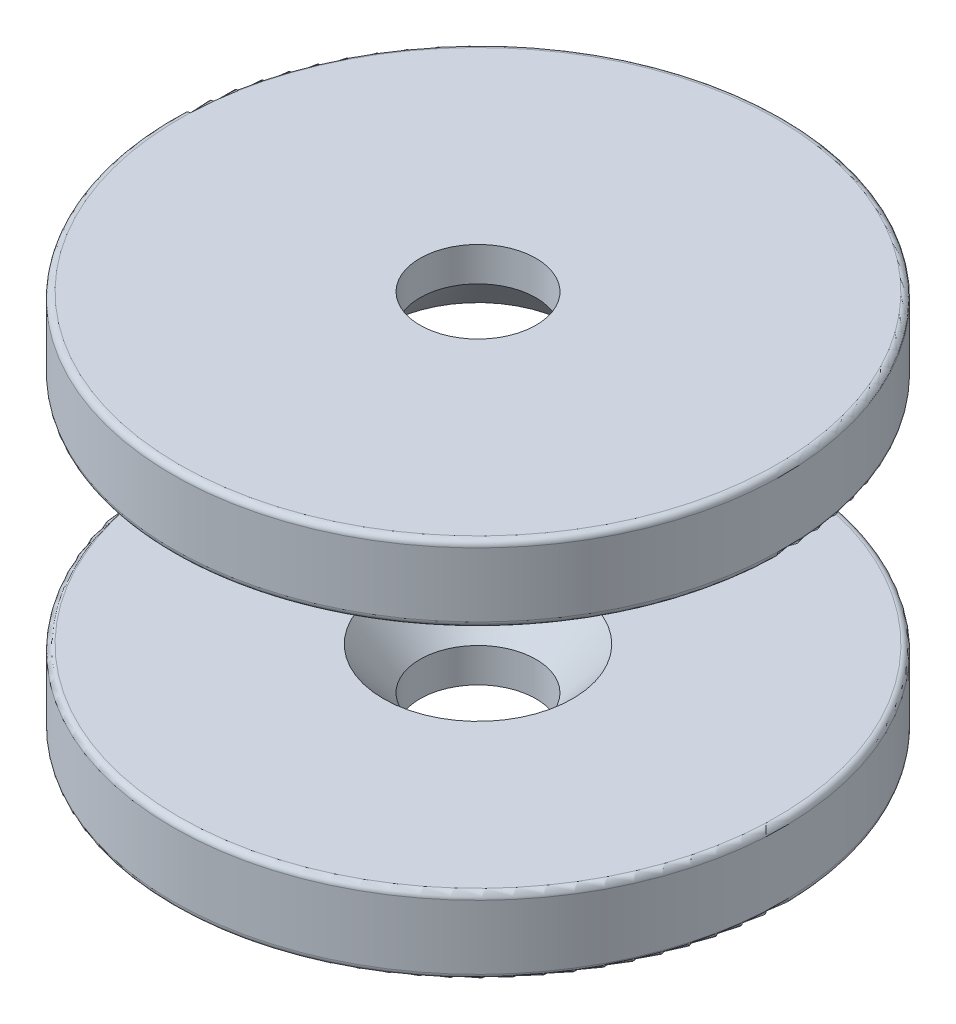
ISO-10303-21;
HEADER;
FILE_DESCRIPTION(('STEP AP214'),'2;1');
FILE_NAME('part.step','',(''),(''),'','','');
FILE_SCHEMA(('AUTOMOTIVE_DESIGN { 1 0 10303 214 1 1 1 1 }'));
ENDSEC;
DATA;
#1=APPLICATION_CONTEXT('core data for automotive mechanical design processes');
#2=APPLICATION_PROTOCOL_DEFINITION('international standard','automotive_design',2000,#1);
#3=PRODUCT_CONTEXT('',#1,'mechanical');
#4=PRODUCT('Part','Part','',(#3));
#5=PRODUCT_RELATED_PRODUCT_CATEGORY('part','',(#4));
#6=PRODUCT_DEFINITION_FORMATION('','',#4);
#7=PRODUCT_DEFINITION_CONTEXT('part definition',#1,'design');
#8=PRODUCT_DEFINITION('design','',#6,#7);
#9=PRODUCT_DEFINITION_SHAPE('','',#8);
#10=(LENGTH_UNIT() NAMED_UNIT(*) SI_UNIT(.MILLI.,.METRE.));
#11=(NAMED_UNIT(*) PLANE_ANGLE_UNIT() SI_UNIT($,.RADIAN.));
#12=(NAMED_UNIT(*) SI_UNIT($,.STERADIAN.) SOLID_ANGLE_UNIT());
#13=UNCERTAINTY_MEASURE_WITH_UNIT(LENGTH_MEASURE(1.E-05),#10,'distance_accuracy_value','');
#14=(GEOMETRIC_REPRESENTATION_CONTEXT(3) GLOBAL_UNCERTAINTY_ASSIGNED_CONTEXT((#13)) GLOBAL_UNIT_ASSIGNED_CONTEXT((#10,
#11,#12)) REPRESENTATION_CONTEXT('',''));
#15=CARTESIAN_POINT('',(0.,0.,0.));
#16=DIRECTION('',(0.,0.,1.));
#17=DIRECTION('',(1.,0.,0.));
#18=AXIS2_PLACEMENT_3D('',#15,#16,#17);
#19=CARTESIAN_POINT('',(0.,11.1125,0.));
#20=DIRECTION('',(0.,-1.,0.));
#21=DIRECTION('',(0.,0.,-1.));
#22=AXIS2_PLACEMENT_3D('',#19,#20,#21);
#23=PLANE('',#22);
#24=CARTESIAN_POINT('',(0.,11.1125,0.));
#25=DIRECTION('',(0.,-1.,0.));
#26=DIRECTION('',(0.,0.,-1.));
#27=AXIS2_PLACEMENT_3D('',#24,#25,#26);
#28=CIRCLE('',#27,3.937);
#29=CARTESIAN_POINT('',(0.,11.1125,-3.93700000000001));
#30=VERTEX_POINT('',#29);
#31=EDGE_CURVE('E61',#30,#30,#28,.T.);
#32=ORIENTED_EDGE('',*,*,#31,.F.);
#33=EDGE_LOOP('',(#32));
#34=FACE_BOUND('',#33,.T.);
#35=CARTESIAN_POINT('',(0.,11.1125,0.));
#36=DIRECTION('',(0.,-1.,0.));
#37=DIRECTION('',(0.,0.,-1.));
#38=AXIS2_PLACEMENT_3D('',#35,#36,#37);
#39=CIRCLE('',#38,12.446);
#40=CARTESIAN_POINT('',(0.,11.1125000000001,-12.446));
#41=VERTEX_POINT('',#40);
#42=EDGE_CURVE('E11',#41,#41,#39,.T.);
#43=ORIENTED_EDGE('',*,*,#42,.T.);
#44=EDGE_LOOP('',(#43));
#45=FACE_BOUND('',#44,.T.);
#46=ADVANCED_FACE('F38',(#34,#45),#23,.T.);
#47=CARTESIAN_POINT('',(0.,14.2875,0.));
#48=DIRECTION('',(0.,-1.,0.));
#49=DIRECTION('',(0.,0.,-1.));
#50=AXIS2_PLACEMENT_3D('',#47,#48,#49);
#51=PLANE('',#50);
#52=CARTESIAN_POINT('',(0.,14.2875,0.));
#53=DIRECTION('',(0.,-1.,0.));
#54=DIRECTION('',(0.,0.,-1.));
#55=AXIS2_PLACEMENT_3D('',#52,#53,#54);
#56=CIRCLE('',#55,12.446);
#57=CARTESIAN_POINT('',(0.,14.2875000000001,-12.446));
#58=VERTEX_POINT('',#57);
#59=EDGE_CURVE('E46',#58,#58,#56,.F.);
#60=ORIENTED_EDGE('',*,*,#59,.T.);
#61=EDGE_LOOP('',(#60));
#62=FACE_BOUND('',#61,.T.);
#63=CARTESIAN_POINT('',(0.,14.2875,0.));
#64=DIRECTION('',(0.,-1.,0.));
#65=DIRECTION('',(0.,0.,-1.));
#66=AXIS2_PLACEMENT_3D('',#63,#64,#65);
#67=CIRCLE('',#66,2.413);
#68=CARTESIAN_POINT('',(0.,14.2875,-2.41299999999999));
#69=VERTEX_POINT('',#68);
#70=EDGE_CURVE('E58',#69,#69,#67,.T.);
#71=ORIENTED_EDGE('',*,*,#70,.T.);
#72=EDGE_LOOP('',(#71));
#73=FACE_BOUND('',#72,.T.);
#74=ADVANCED_FACE('F78',(#62,#73),#51,.F.);
#75=CARTESIAN_POINT('',(0.,11.1125,0.));
#76=DIRECTION('',(0.,1.,0.));
#77=DIRECTION('',(0.,0.,1.));
#78=AXIS2_PLACEMENT_3D('',#75,#76,#77);
#79=CYLINDRICAL_SURFACE('',#78,12.7);
#80=CARTESIAN_POINT('',(0.,14.0335,0.));
#81=DIRECTION('',(0.,-1.,0.));
#82=DIRECTION('',(0.,0.,-1.));
#83=AXIS2_PLACEMENT_3D('',#80,#81,#82);
#84=CIRCLE('',#83,12.7);
#85=CARTESIAN_POINT('',(0.,14.0335000000001,-12.7));
#86=VERTEX_POINT('',#85);
#87=EDGE_CURVE('E50',#86,#86,#84,.T.);
#88=ORIENTED_EDGE('',*,*,#87,.T.);
#89=EDGE_LOOP('',(#88));
#90=FACE_BOUND('',#89,.T.);
#91=CARTESIAN_POINT('',(0.,11.3665,0.));
#92=DIRECTION('',(0.,-1.,0.));
#93=DIRECTION('',(0.,0.,-1.));
#94=AXIS2_PLACEMENT_3D('',#91,#92,#93);
#95=CIRCLE('',#94,12.7);
#96=CARTESIAN_POINT('',(0.,11.3665000000001,-12.7));
#97=VERTEX_POINT('',#96);
#98=EDGE_CURVE('E55',#97,#97,#95,.F.);
#99=ORIENTED_EDGE('',*,*,#98,.T.);
#100=EDGE_LOOP('',(#99));
#101=FACE_BOUND('',#100,.T.);
#102=ADVANCED_FACE('F74',(#90,#101),#79,.T.);
#103=CARTESIAN_POINT('',(0.,11.1125,0.));
#104=DIRECTION('',(0.,1.,0.));
#105=DIRECTION('',(0.,0.,1.));
#106=AXIS2_PLACEMENT_3D('',#103,#104,#105);
#107=CYLINDRICAL_SURFACE('',#106,2.413);
#108=CARTESIAN_POINT('',(0.,12.8656614526048,0.));
#109=DIRECTION('',(0.,-1.,0.));
#110=DIRECTION('',(0.,0.,-1.));
#111=AXIS2_PLACEMENT_3D('',#108,#109,#110);
#112=CIRCLE('',#111,2.413);
#113=CARTESIAN_POINT('',(0.,12.8656614526048,-2.413));
#114=VERTEX_POINT('',#113);
#115=EDGE_CURVE('E42',#114,#114,#112,.F.);
#116=ORIENTED_EDGE('',*,*,#115,.F.);
#117=EDGE_LOOP('',(#116));
#118=FACE_BOUND('',#117,.T.);
#119=ORIENTED_EDGE('',*,*,#70,.F.);
#120=EDGE_LOOP('',(#119));
#121=FACE_BOUND('',#120,.T.);
#122=ADVANCED_FACE('F70',(#118,#121),#107,.F.);
#123=CARTESIAN_POINT('',(0.,14.0335,0.));
#124=DIRECTION('',(0.,-1.,0.));
#125=DIRECTION('',(0.,0.,-1.));
#126=AXIS2_PLACEMENT_3D('',#123,#124,#125);
#127=TOROIDAL_SURFACE('',#126,12.446,0.254);
#128=ORIENTED_EDGE('',*,*,#59,.F.);
#129=EDGE_LOOP('',(#128));
#130=FACE_BOUND('',#129,.T.);
#131=ORIENTED_EDGE('',*,*,#87,.F.);
#132=EDGE_LOOP('',(#131));
#133=FACE_BOUND('',#132,.T.);
#134=ADVANCED_FACE('F73',(#130,#133),#127,.T.);
#135=CARTESIAN_POINT('',(0.,11.3665,0.));
#136=DIRECTION('',(0.,-1.,0.));
#137=DIRECTION('',(0.,0.,-1.));
#138=AXIS2_PLACEMENT_3D('',#135,#136,#137);
#139=TOROIDAL_SURFACE('',#138,12.446,0.254);
#140=ORIENTED_EDGE('',*,*,#98,.F.);
#141=EDGE_LOOP('',(#140));
#142=FACE_BOUND('',#141,.T.);
#143=ORIENTED_EDGE('',*,*,#42,.F.);
#144=EDGE_LOOP('',(#143));
#145=FACE_BOUND('',#144,.T.);
#146=ADVANCED_FACE('F40',(#142,#145),#139,.T.);
#147=CARTESIAN_POINT('',(0.,11.1125,0.));
#148=DIRECTION('',(0.,-1.,0.));
#149=DIRECTION('',(0.,0.,-1.));
#150=AXIS2_PLACEMENT_3D('',#147,#148,#149);
#151=CONICAL_SURFACE('',#150,3.937,0.715584993317677);
#152=ORIENTED_EDGE('',*,*,#115,.T.);
#153=EDGE_LOOP('',(#152));
#154=FACE_BOUND('',#153,.T.);
#155=ORIENTED_EDGE('',*,*,#31,.T.);
#156=EDGE_LOOP('',(#155));
#157=FACE_BOUND('',#156,.T.);
#158=ADVANCED_FACE('F68',(#154,#157),#151,.F.);
#159=CLOSED_SHELL('',(#46,#74,#102,#122,#134,#146,#158));
#160=MANIFOLD_SOLID_BREP('B2',#159);
#161=CARTESIAN_POINT('',(0.,1.5875,0.));
#162=DIRECTION('',(0.,1.,0.));
#163=DIRECTION('',(0.,0.,1.));
#164=AXIS2_PLACEMENT_3D('',#161,#162,#163);
#165=PLANE('',#164);
#166=CARTESIAN_POINT('',(0.,1.5875,0.));
#167=DIRECTION('',(0.,1.,0.));
#168=DIRECTION('',(0.,0.,1.));
#169=AXIS2_PLACEMENT_3D('',#166,#167,#168);
#170=CIRCLE('',#169,3.937);
#171=CARTESIAN_POINT('',(0.,1.5875,3.937));
#172=VERTEX_POINT('',#171);
#173=EDGE_CURVE('E167',#172,#172,#170,.T.);
#174=ORIENTED_EDGE('',*,*,#173,.F.);
#175=EDGE_LOOP('',(#174));
#176=FACE_BOUND('',#175,.T.);
#177=CARTESIAN_POINT('',(0.,1.5875,0.));
#178=DIRECTION('',(0.,1.,0.));
#179=DIRECTION('',(0.,0.,1.));
#180=AXIS2_PLACEMENT_3D('',#177,#178,#179);
#181=CIRCLE('',#180,12.446);
#182=CARTESIAN_POINT('',(0.,1.5875,12.446));
#183=VERTEX_POINT('',#182);
#184=EDGE_CURVE('E37',#183,#183,#181,.T.);
#185=ORIENTED_EDGE('',*,*,#184,.T.);
#186=EDGE_LOOP('',(#185));
#187=FACE_BOUND('',#186,.T.);
#188=ADVANCED_FACE('F144',(#176,#187),#165,.T.);
#189=CARTESIAN_POINT('',(0.,-1.5875,0.));
#190=DIRECTION('',(0.,1.,0.));
#191=DIRECTION('',(0.,0.,1.));
#192=AXIS2_PLACEMENT_3D('',#189,#190,#191);
#193=PLANE('',#192);
#194=CARTESIAN_POINT('',(0.,-1.5875,0.));
#195=DIRECTION('',(0.,1.,0.));
#196=DIRECTION('',(0.,0.,1.));
#197=AXIS2_PLACEMENT_3D('',#194,#195,#196);
#198=CIRCLE('',#197,12.446);
#199=CARTESIAN_POINT('',(0.,-1.5875,12.446));
#200=VERTEX_POINT('',#199);
#201=EDGE_CURVE('E152',#200,#200,#198,.F.);
#202=ORIENTED_EDGE('',*,*,#201,.T.);
#203=EDGE_LOOP('',(#202));
#204=FACE_BOUND('',#203,.T.);
#205=CARTESIAN_POINT('',(0.,-1.5875,0.));
#206=DIRECTION('',(0.,1.,0.));
#207=DIRECTION('',(0.,0.,1.));
#208=AXIS2_PLACEMENT_3D('',#205,#206,#207);
#209=CIRCLE('',#208,2.413);
#210=CARTESIAN_POINT('',(0.,-1.5875,2.413));
#211=VERTEX_POINT('',#210);
#212=EDGE_CURVE('E164',#211,#211,#209,.T.);
#213=ORIENTED_EDGE('',*,*,#212,.T.);
#214=EDGE_LOOP('',(#213));
#215=FACE_BOUND('',#214,.T.);
#216=ADVANCED_FACE('F184',(#204,#215),#193,.F.);
#217=CARTESIAN_POINT('',(0.,1.5875,0.));
#218=DIRECTION('',(0.,-1.,0.));
#219=DIRECTION('',(0.,0.,-1.));
#220=AXIS2_PLACEMENT_3D('',#217,#218,#219);
#221=CYLINDRICAL_SURFACE('',#220,12.7);
#222=CARTESIAN_POINT('',(0.,-1.3335,0.));
#223=DIRECTION('',(0.,1.,0.));
#224=DIRECTION('',(0.,0.,1.));
#225=AXIS2_PLACEMENT_3D('',#222,#223,#224);
#226=CIRCLE('',#225,12.7);
#227=CARTESIAN_POINT('',(0.,-1.3335,12.7));
#228=VERTEX_POINT('',#227);
#229=EDGE_CURVE('E156',#228,#228,#226,.T.);
#230=ORIENTED_EDGE('',*,*,#229,.T.);
#231=EDGE_LOOP('',(#230));
#232=FACE_BOUND('',#231,.T.);
#233=CARTESIAN_POINT('',(0.,1.3335,0.));
#234=DIRECTION('',(0.,1.,0.));
#235=DIRECTION('',(0.,0.,1.));
#236=AXIS2_PLACEMENT_3D('',#233,#234,#235);
#237=CIRCLE('',#236,12.7);
#238=CARTESIAN_POINT('',(0.,1.3335,12.7));
#239=VERTEX_POINT('',#238);
#240=EDGE_CURVE('E161',#239,#239,#237,.F.);
#241=ORIENTED_EDGE('',*,*,#240,.T.);
#242=EDGE_LOOP('',(#241));
#243=FACE_BOUND('',#242,.T.);
#244=ADVANCED_FACE('F180',(#232,#243),#221,.T.);
#245=CARTESIAN_POINT('',(0.,1.5875,0.));
#246=DIRECTION('',(0.,-1.,0.));
#247=DIRECTION('',(0.,0.,-1.));
#248=AXIS2_PLACEMENT_3D('',#245,#246,#247);
#249=CYLINDRICAL_SURFACE('',#248,2.413);
#250=CARTESIAN_POINT('',(0.,-0.165661452604813,0.));
#251=DIRECTION('',(0.,1.,0.));
#252=DIRECTION('',(0.,0.,1.));
#253=AXIS2_PLACEMENT_3D('',#250,#251,#252);
#254=CIRCLE('',#253,2.413);
#255=CARTESIAN_POINT('',(0.,-0.165661452604813,2.413));
#256=VERTEX_POINT('',#255);
#257=EDGE_CURVE('E148',#256,#256,#254,.F.);
#258=ORIENTED_EDGE('',*,*,#257,.F.);
#259=EDGE_LOOP('',(#258));
#260=FACE_BOUND('',#259,.T.);
#261=ORIENTED_EDGE('',*,*,#212,.F.);
#262=EDGE_LOOP('',(#261));
#263=FACE_BOUND('',#262,.T.);
#264=ADVANCED_FACE('F176',(#260,#263),#249,.F.);
#265=CARTESIAN_POINT('',(0.,-1.3335,0.));
#266=DIRECTION('',(0.,1.,0.));
#267=DIRECTION('',(0.,0.,1.));
#268=AXIS2_PLACEMENT_3D('',#265,#266,#267);
#269=TOROIDAL_SURFACE('',#268,12.446,0.254);
#270=ORIENTED_EDGE('',*,*,#201,.F.);
#271=EDGE_LOOP('',(#270));
#272=FACE_BOUND('',#271,.T.);
#273=ORIENTED_EDGE('',*,*,#229,.F.);
#274=EDGE_LOOP('',(#273));
#275=FACE_BOUND('',#274,.T.);
#276=ADVANCED_FACE('F179',(#272,#275),#269,.T.);
#277=CARTESIAN_POINT('',(0.,1.3335,0.));
#278=DIRECTION('',(0.,1.,0.));
#279=DIRECTION('',(0.,0.,1.));
#280=AXIS2_PLACEMENT_3D('',#277,#278,#279);
#281=TOROIDAL_SURFACE('',#280,12.446,0.254);
#282=ORIENTED_EDGE('',*,*,#240,.F.);
#283=EDGE_LOOP('',(#282));
#284=FACE_BOUND('',#283,.T.);
#285=ORIENTED_EDGE('',*,*,#184,.F.);
#286=EDGE_LOOP('',(#285));
#287=FACE_BOUND('',#286,.T.);
#288=ADVANCED_FACE('F146',(#284,#287),#281,.T.);
#289=CARTESIAN_POINT('',(0.,1.5875,0.));
#290=DIRECTION('',(0.,1.,0.));
#291=DIRECTION('',(0.,0.,1.));
#292=AXIS2_PLACEMENT_3D('',#289,#290,#291);
#293=CONICAL_SURFACE('',#292,3.937,0.715584993317677);
#294=ORIENTED_EDGE('',*,*,#257,.T.);
#295=EDGE_LOOP('',(#294));
#296=FACE_BOUND('',#295,.T.);
#297=ORIENTED_EDGE('',*,*,#173,.T.);
#298=EDGE_LOOP('',(#297));
#299=FACE_BOUND('',#298,.T.);
#300=ADVANCED_FACE('F174',(#296,#299),#293,.F.);
#301=CLOSED_SHELL('',(#188,#216,#244,#264,#276,#288,#300));
#302=MANIFOLD_SOLID_BREP('B6',#301);
#303=ADVANCED_BREP_SHAPE_REPRESENTATION('',(#18,#160,#302),#14);
#304=SHAPE_DEFINITION_REPRESENTATION(#9,#303);
ENDSEC;
END-ISO-10303-21;
